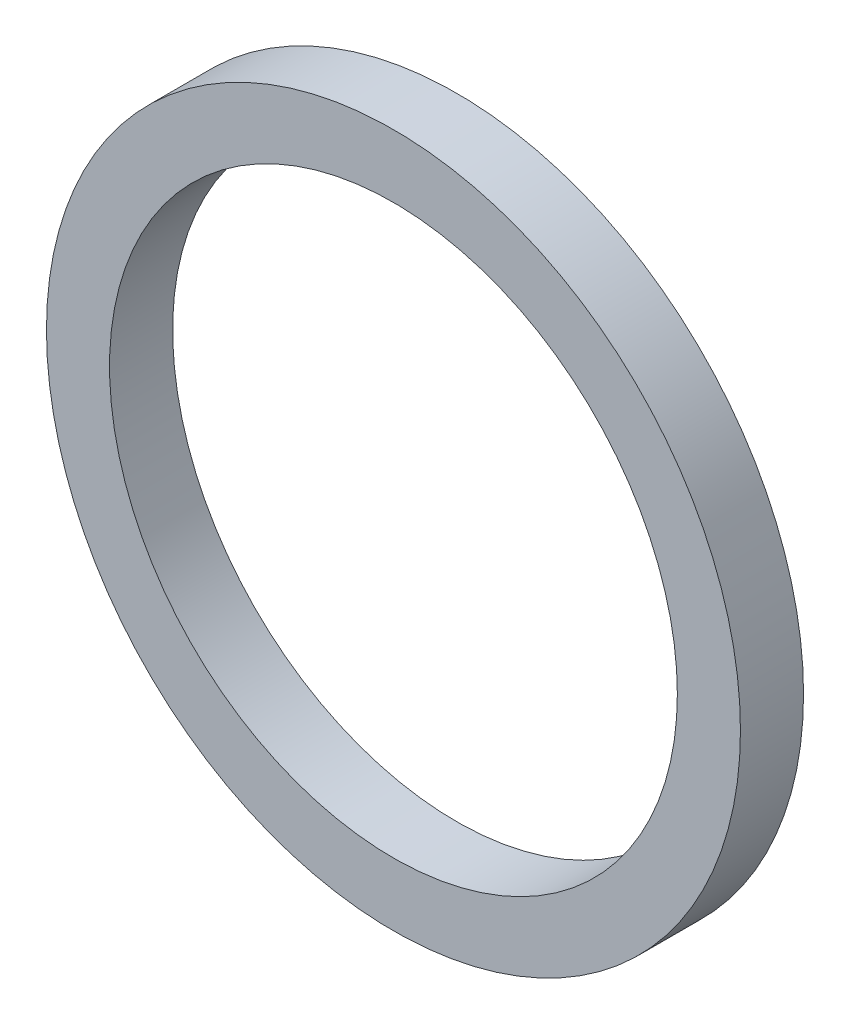
ISO-10303-21;
HEADER;
FILE_DESCRIPTION(('STEP AP214'),'2;1');
FILE_NAME('part.step','',(''),(''),'','','');
FILE_SCHEMA(('AUTOMOTIVE_DESIGN { 1 0 10303 214 1 1 1 1 }'));
ENDSEC;
DATA;
#1=APPLICATION_CONTEXT('core data for automotive mechanical design processes');
#2=APPLICATION_PROTOCOL_DEFINITION('international standard','automotive_design',2000,#1);
#3=PRODUCT_CONTEXT('',#1,'mechanical');
#4=PRODUCT('Part','Part','',(#3));
#5=PRODUCT_RELATED_PRODUCT_CATEGORY('part','',(#4));
#6=PRODUCT_DEFINITION_FORMATION('','',#4);
#7=PRODUCT_DEFINITION_CONTEXT('part definition',#1,'design');
#8=PRODUCT_DEFINITION('design','',#6,#7);
#9=PRODUCT_DEFINITION_SHAPE('','',#8);
#10=(LENGTH_UNIT() NAMED_UNIT(*) SI_UNIT(.MILLI.,.METRE.));
#11=(NAMED_UNIT(*) PLANE_ANGLE_UNIT() SI_UNIT($,.RADIAN.));
#12=(NAMED_UNIT(*) SI_UNIT($,.STERADIAN.) SOLID_ANGLE_UNIT());
#13=UNCERTAINTY_MEASURE_WITH_UNIT(LENGTH_MEASURE(1.E-05),#10,'distance_accuracy_value','');
#14=(GEOMETRIC_REPRESENTATION_CONTEXT(3) GLOBAL_UNCERTAINTY_ASSIGNED_CONTEXT((#13)) GLOBAL_UNIT_ASSIGNED_CONTEXT((#10,
#11,#12)) REPRESENTATION_CONTEXT('',''));
#15=CARTESIAN_POINT('',(0.,0.,0.));
#16=DIRECTION('',(0.,0.,1.));
#17=DIRECTION('',(1.,0.,0.));
#18=AXIS2_PLACEMENT_3D('',#15,#16,#17);
#19=CARTESIAN_POINT('',(0.,0.,10.));
#20=DIRECTION('',(0.,0.,1.));
#21=DIRECTION('',(1.,0.,0.));
#22=AXIS2_PLACEMENT_3D('',#19,#20,#21);
#23=PLANE('',#22);
#24=CARTESIAN_POINT('',(0.,0.,10.));
#25=DIRECTION('',(0.,0.,1.));
#26=DIRECTION('',(1.,0.,0.));
#27=AXIS2_PLACEMENT_3D('',#24,#25,#26);
#28=CIRCLE('',#27,55.);
#29=CARTESIAN_POINT('',(55.,0.,10.));
#30=VERTEX_POINT('',#29);
#31=EDGE_CURVE('E10',#30,#30,#28,.T.);
#32=ORIENTED_EDGE('',*,*,#31,.T.);
#33=EDGE_LOOP('',(#32));
#34=FACE_BOUND('',#33,.T.);
#35=CARTESIAN_POINT('',(0.,0.,10.));
#36=DIRECTION('',(0.,0.,1.));
#37=DIRECTION('',(1.,0.,0.));
#38=AXIS2_PLACEMENT_3D('',#35,#36,#37);
#39=CIRCLE('',#38,45.);
#40=CARTESIAN_POINT('',(45.,0.,10.));
#41=VERTEX_POINT('',#40);
#42=EDGE_CURVE('E52',#41,#41,#39,.T.);
#43=ORIENTED_EDGE('',*,*,#42,.F.);
#44=EDGE_LOOP('',(#43));
#45=FACE_BOUND('',#44,.T.);
#46=ADVANCED_FACE('F41',(#34,#45),#23,.T.);
#47=CARTESIAN_POINT('',(0.,0.,0.));
#48=DIRECTION('',(0.,0.,1.));
#49=DIRECTION('',(1.,0.,0.));
#50=AXIS2_PLACEMENT_3D('',#47,#48,#49);
#51=PLANE('',#50);
#52=CARTESIAN_POINT('',(0.,0.,0.));
#53=DIRECTION('',(0.,0.,1.));
#54=DIRECTION('',(1.,0.,0.));
#55=AXIS2_PLACEMENT_3D('',#52,#53,#54);
#56=CIRCLE('',#55,55.);
#57=CARTESIAN_POINT('',(55.,0.,0.));
#58=VERTEX_POINT('',#57);
#59=EDGE_CURVE('E45',#58,#58,#56,.T.);
#60=ORIENTED_EDGE('',*,*,#59,.F.);
#61=EDGE_LOOP('',(#60));
#62=FACE_BOUND('',#61,.T.);
#63=CARTESIAN_POINT('',(0.,0.,0.));
#64=DIRECTION('',(0.,0.,1.));
#65=DIRECTION('',(1.,0.,0.));
#66=AXIS2_PLACEMENT_3D('',#63,#64,#65);
#67=CIRCLE('',#66,45.);
#68=CARTESIAN_POINT('',(45.,0.,0.));
#69=VERTEX_POINT('',#68);
#70=EDGE_CURVE('E54',#69,#69,#67,.T.);
#71=ORIENTED_EDGE('',*,*,#70,.T.);
#72=EDGE_LOOP('',(#71));
#73=FACE_BOUND('',#72,.T.);
#74=ADVANCED_FACE('F64',(#62,#73),#51,.F.);
#75=CARTESIAN_POINT('',(0.,0.,10.));
#76=DIRECTION('',(0.,0.,-1.));
#77=DIRECTION('',(-1.,0.,0.));
#78=AXIS2_PLACEMENT_3D('',#75,#76,#77);
#79=CYLINDRICAL_SURFACE('',#78,55.);
#80=ORIENTED_EDGE('',*,*,#31,.F.);
#81=EDGE_LOOP('',(#80));
#82=FACE_BOUND('',#81,.T.);
#83=ORIENTED_EDGE('',*,*,#59,.T.);
#84=EDGE_LOOP('',(#83));
#85=FACE_BOUND('',#84,.T.);
#86=ADVANCED_FACE('F43',(#82,#85),#79,.T.);
#87=CARTESIAN_POINT('',(0.,0.,10.));
#88=DIRECTION('',(0.,0.,-1.));
#89=DIRECTION('',(-1.,0.,0.));
#90=AXIS2_PLACEMENT_3D('',#87,#88,#89);
#91=CYLINDRICAL_SURFACE('',#90,45.);
#92=ORIENTED_EDGE('',*,*,#42,.T.);
#93=EDGE_LOOP('',(#92));
#94=FACE_BOUND('',#93,.T.);
#95=ORIENTED_EDGE('',*,*,#70,.F.);
#96=EDGE_LOOP('',(#95));
#97=FACE_BOUND('',#96,.T.);
#98=ADVANCED_FACE('F60',(#94,#97),#91,.F.);
#99=CLOSED_SHELL('',(#46,#74,#86,#98));
#100=MANIFOLD_SOLID_BREP('B2',#99);
#101=ADVANCED_BREP_SHAPE_REPRESENTATION('',(#18,#100),#14);
#102=SHAPE_DEFINITION_REPRESENTATION(#9,#101);
ENDSEC;
END-ISO-10303-21;
